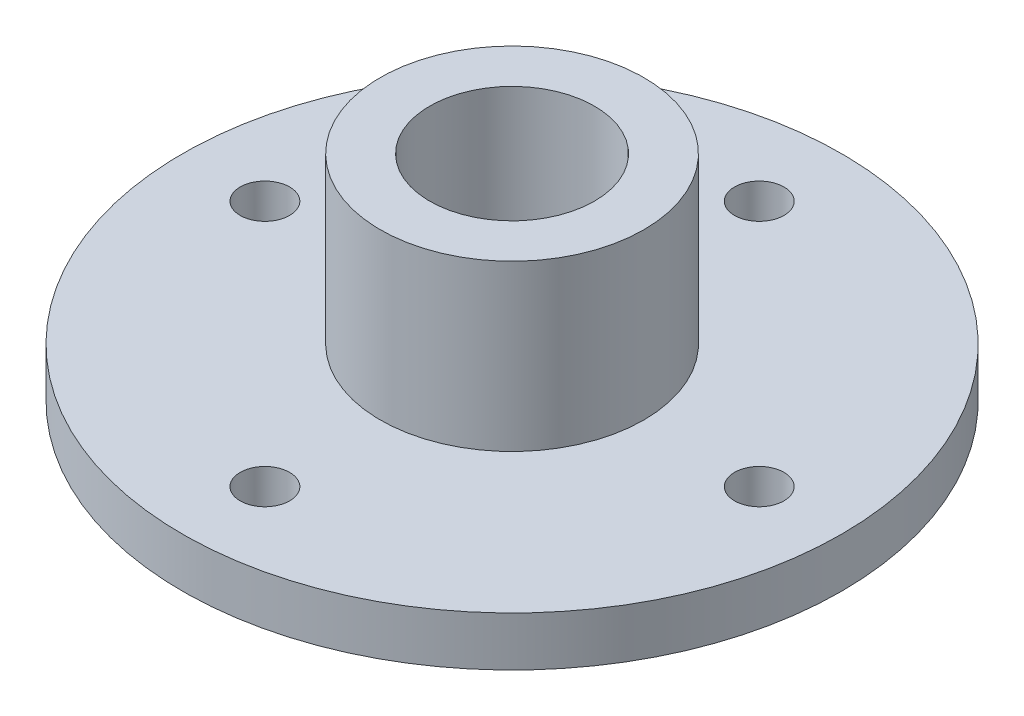
ISO-10303-21;
HEADER;
FILE_DESCRIPTION(('STEP AP214'),'2;1');
FILE_NAME('part.step','',(''),(''),'','','');
FILE_SCHEMA(('AUTOMOTIVE_DESIGN { 1 0 10303 214 1 1 1 1 }'));
ENDSEC;
DATA;
#1=APPLICATION_CONTEXT('core data for automotive mechanical design processes');
#2=APPLICATION_PROTOCOL_DEFINITION('international standard','automotive_design',2000,#1);
#3=PRODUCT_CONTEXT('',#1,'mechanical');
#4=PRODUCT('Part','Part','',(#3));
#5=PRODUCT_RELATED_PRODUCT_CATEGORY('part','',(#4));
#6=PRODUCT_DEFINITION_FORMATION('','',#4);
#7=PRODUCT_DEFINITION_CONTEXT('part definition',#1,'design');
#8=PRODUCT_DEFINITION('design','',#6,#7);
#9=PRODUCT_DEFINITION_SHAPE('','',#8);
#10=(LENGTH_UNIT() NAMED_UNIT(*) SI_UNIT(.MILLI.,.METRE.));
#11=(NAMED_UNIT(*) PLANE_ANGLE_UNIT() SI_UNIT($,.RADIAN.));
#12=(NAMED_UNIT(*) SI_UNIT($,.STERADIAN.) SOLID_ANGLE_UNIT());
#13=UNCERTAINTY_MEASURE_WITH_UNIT(LENGTH_MEASURE(1.E-05),#10,'distance_accuracy_value','');
#14=(GEOMETRIC_REPRESENTATION_CONTEXT(3) GLOBAL_UNCERTAINTY_ASSIGNED_CONTEXT((#13)) GLOBAL_UNIT_ASSIGNED_CONTEXT((#10,
#11,#12)) REPRESENTATION_CONTEXT('',''));
#15=CARTESIAN_POINT('',(0.,0.,0.));
#16=DIRECTION('',(0.,0.,1.));
#17=DIRECTION('',(1.,0.,0.));
#18=AXIS2_PLACEMENT_3D('',#15,#16,#17);
#19=CARTESIAN_POINT('',(1.96764178370323E-12,-573.614855464536,0.));
#20=DIRECTION('',(0.,-1.,0.));
#21=DIRECTION('',(1.,0.,0.));
#22=AXIS2_PLACEMENT_3D('',#19,#20,#21);
#23=CYLINDRICAL_SURFACE('',#22,5.00000000002364);
#24=CARTESIAN_POINT('',(0.,13.,0.));
#25=DIRECTION('',(0.,-1.,0.));
#26=DIRECTION('',(1.,0.,0.));
#27=AXIS2_PLACEMENT_3D('',#24,#25,#26);
#28=CIRCLE('',#27,5.00000000000003);
#29=CARTESIAN_POINT('',(4.99999999999999,13.,0.));
#30=VERTEX_POINT('',#29);
#31=EDGE_CURVE('E65',#30,#30,#28,.T.);
#32=ORIENTED_EDGE('',*,*,#31,.F.);
#33=EDGE_LOOP('',(#32));
#34=FACE_BOUND('',#33,.T.);
#35=CARTESIAN_POINT('',(0.,0.,0.));
#36=DIRECTION('',(0.,-1.,0.));
#37=DIRECTION('',(1.,0.,0.));
#38=AXIS2_PLACEMENT_3D('',#35,#36,#37);
#39=CIRCLE('',#38,5.00000000004725);
#40=CARTESIAN_POINT('',(5.00000000004725,0.,0.));
#41=VERTEX_POINT('',#40);
#42=EDGE_CURVE('E10',#41,#41,#39,.T.);
#43=ORIENTED_EDGE('',*,*,#42,.T.);
#44=EDGE_LOOP('',(#43));
#45=FACE_BOUND('',#44,.T.);
#46=ADVANCED_FACE('F38',(#34,#45),#23,.F.);
#47=CARTESIAN_POINT('',(-5.00000000004725,0.,0.));
#48=DIRECTION('',(0.,1.,0.));
#49=DIRECTION('',(-1.,0.,0.));
#50=AXIS2_PLACEMENT_3D('',#47,#48,#49);
#51=PLANE('',#50);
#52=CARTESIAN_POINT('',(0.,0.,-15.));
#53=DIRECTION('',(0.,1.,0.));
#54=DIRECTION('',(-1.,0.,0.));
#55=AXIS2_PLACEMENT_3D('',#52,#53,#54);
#56=CIRCLE('',#55,1.5);
#57=CARTESIAN_POINT('',(-1.5,0.,-15.));
#58=VERTEX_POINT('',#57);
#59=EDGE_CURVE('E58',#58,#58,#56,.T.);
#60=ORIENTED_EDGE('',*,*,#59,.T.);
#61=EDGE_LOOP('',(#60));
#62=FACE_BOUND('',#61,.T.);
#63=CARTESIAN_POINT('',(15.,0.,0.));
#64=DIRECTION('',(0.,1.,0.));
#65=DIRECTION('',(-1.,0.,0.));
#66=AXIS2_PLACEMENT_3D('',#63,#64,#65);
#67=CIRCLE('',#66,1.5);
#68=CARTESIAN_POINT('',(13.5,0.,0.));
#69=VERTEX_POINT('',#68);
#70=EDGE_CURVE('E126',#69,#69,#67,.T.);
#71=ORIENTED_EDGE('',*,*,#70,.T.);
#72=EDGE_LOOP('',(#71));
#73=FACE_BOUND('',#72,.T.);
#74=CARTESIAN_POINT('',(-1.04744440165294E-13,0.,15.));
#75=DIRECTION('',(0.,1.,0.));
#76=DIRECTION('',(-1.,0.,0.));
#77=AXIS2_PLACEMENT_3D('',#74,#75,#76);
#78=CIRCLE('',#77,1.5);
#79=CARTESIAN_POINT('',(-1.5000000000001,0.,15.));
#80=VERTEX_POINT('',#79);
#81=EDGE_CURVE('E130',#80,#80,#78,.T.);
#82=ORIENTED_EDGE('',*,*,#81,.T.);
#83=EDGE_LOOP('',(#82));
#84=FACE_BOUND('',#83,.T.);
#85=CARTESIAN_POINT('',(-15.,-1.02782365951626E-13,-1.57116660247941E-13));
#86=DIRECTION('',(0.,1.,0.));
#87=DIRECTION('',(-1.,0.,0.));
#88=AXIS2_PLACEMENT_3D('',#85,#86,#87);
#89=CIRCLE('',#88,1.5);
#90=CARTESIAN_POINT('',(-16.5,-1.07927739449954E-13,-1.57116660247941E-13));
#91=VERTEX_POINT('',#90);
#92=EDGE_CURVE('E77',#91,#91,#89,.T.);
#93=ORIENTED_EDGE('',*,*,#92,.T.);
#94=EDGE_LOOP('',(#93));
#95=FACE_BOUND('',#94,.T.);
#96=ORIENTED_EDGE('',*,*,#42,.F.);
#97=EDGE_LOOP('',(#96));
#98=FACE_BOUND('',#97,.T.);
#99=CARTESIAN_POINT('',(0.,1.11022302462516E-13,0.));
#100=DIRECTION('',(0.,-1.,0.));
#101=DIRECTION('',(1.,0.,0.));
#102=AXIS2_PLACEMENT_3D('',#99,#100,#101);
#103=CIRCLE('',#102,20.0000000000001);
#104=CARTESIAN_POINT('',(20.0000000000001,1.79627282440231E-13,0.));
#105=VERTEX_POINT('',#104);
#106=EDGE_CURVE('E45',#105,#105,#103,.T.);
#107=ORIENTED_EDGE('',*,*,#106,.T.);
#108=EDGE_LOOP('',(#107));
#109=FACE_BOUND('',#108,.T.);
#110=ADVANCED_FACE('F109',(#62,#73,#84,#95,#98,#109),#51,.F.);
#111=CARTESIAN_POINT('',(1.96764178370323E-12,-573.614855464536,0.));
#112=DIRECTION('',(0.,-1.,0.));
#113=DIRECTION('',(1.,0.,0.));
#114=AXIS2_PLACEMENT_3D('',#111,#112,#113);
#115=CYLINDRICAL_SURFACE('',#114,20.0000000000001);
#116=ORIENTED_EDGE('',*,*,#106,.F.);
#117=EDGE_LOOP('',(#116));
#118=FACE_BOUND('',#117,.T.);
#119=CARTESIAN_POINT('',(0.,3.00000000000011,0.));
#120=DIRECTION('',(0.,-1.,0.));
#121=DIRECTION('',(1.,0.,0.));
#122=AXIS2_PLACEMENT_3D('',#119,#120,#121);
#123=CIRCLE('',#122,20.0000000000001);
#124=CARTESIAN_POINT('',(20.,3.00000000000018,0.));
#125=VERTEX_POINT('',#124);
#126=EDGE_CURVE('E50',#125,#125,#123,.T.);
#127=ORIENTED_EDGE('',*,*,#126,.T.);
#128=EDGE_LOOP('',(#127));
#129=FACE_BOUND('',#128,.T.);
#130=ADVANCED_FACE('F84',(#118,#129),#115,.T.);
#131=CARTESIAN_POINT('',(-20.0000000000001,2.99999999999998,0.));
#132=DIRECTION('',(0.,-1.,0.));
#133=DIRECTION('',(1.,0.,0.));
#134=AXIS2_PLACEMENT_3D('',#131,#132,#133);
#135=PLANE('',#134);
#136=CARTESIAN_POINT('',(0.,3.00000000000005,-15.));
#137=DIRECTION('',(0.,-1.,0.));
#138=DIRECTION('',(1.,0.,0.));
#139=AXIS2_PLACEMENT_3D('',#136,#137,#138);
#140=CIRCLE('',#139,1.5);
#141=CARTESIAN_POINT('',(1.49999999999999,3.00000000000005,-15.));
#142=VERTEX_POINT('',#141);
#143=EDGE_CURVE('E41',#142,#142,#140,.T.);
#144=ORIENTED_EDGE('',*,*,#143,.T.);
#145=EDGE_LOOP('',(#144));
#146=FACE_BOUND('',#145,.T.);
#147=CARTESIAN_POINT('',(15.,3.0000000000001,0.));
#148=DIRECTION('',(0.,-1.,0.));
#149=DIRECTION('',(1.,0.,0.));
#150=AXIS2_PLACEMENT_3D('',#147,#148,#149);
#151=CIRCLE('',#150,1.5);
#152=CARTESIAN_POINT('',(16.5,3.0000000000001,0.));
#153=VERTEX_POINT('',#152);
#154=EDGE_CURVE('E60',#153,#153,#151,.T.);
#155=ORIENTED_EDGE('',*,*,#154,.T.);
#156=EDGE_LOOP('',(#155));
#157=FACE_BOUND('',#156,.T.);
#158=CARTESIAN_POINT('',(-1.15035187161952E-13,3.00000000000005,15.));
#159=DIRECTION('',(0.,-1.,0.));
#160=DIRECTION('',(1.,0.,0.));
#161=AXIS2_PLACEMENT_3D('',#158,#159,#160);
#162=CIRCLE('',#161,1.5);
#163=CARTESIAN_POINT('',(1.49999999999988,3.00000000000005,15.));
#164=VERTEX_POINT('',#163);
#165=EDGE_CURVE('E57',#164,#164,#162,.T.);
#166=ORIENTED_EDGE('',*,*,#165,.T.);
#167=EDGE_LOOP('',(#166));
#168=FACE_BOUND('',#167,.T.);
#169=CARTESIAN_POINT('',(-15.,3.,-1.57116660247941E-13));
#170=DIRECTION('',(0.,-1.,0.));
#171=DIRECTION('',(1.,0.,0.));
#172=AXIS2_PLACEMENT_3D('',#169,#170,#171);
#173=CIRCLE('',#172,1.5);
#174=CARTESIAN_POINT('',(-13.5,3.,-1.57116660247941E-13));
#175=VERTEX_POINT('',#174);
#176=EDGE_CURVE('E54',#175,#175,#173,.T.);
#177=ORIENTED_EDGE('',*,*,#176,.T.);
#178=EDGE_LOOP('',(#177));
#179=FACE_BOUND('',#178,.T.);
#180=ORIENTED_EDGE('',*,*,#126,.F.);
#181=EDGE_LOOP('',(#180));
#182=FACE_BOUND('',#181,.T.);
#183=CARTESIAN_POINT('',(0.,3.,0.));
#184=DIRECTION('',(0.,-1.,0.));
#185=DIRECTION('',(1.,0.,0.));
#186=AXIS2_PLACEMENT_3D('',#183,#184,#185);
#187=CIRCLE('',#186,7.99999999999999);
#188=CARTESIAN_POINT('',(7.99999999999998,3.00000000000003,0.));
#189=VERTEX_POINT('',#188);
#190=EDGE_CURVE('E74',#189,#189,#187,.T.);
#191=ORIENTED_EDGE('',*,*,#190,.T.);
#192=EDGE_LOOP('',(#191));
#193=FACE_BOUND('',#192,.T.);
#194=ADVANCED_FACE('F86',(#146,#157,#168,#179,#182,#193),#135,.F.);
#195=CARTESIAN_POINT('',(1.96764178370323E-12,-573.614855464536,0.));
#196=DIRECTION('',(0.,-1.,0.));
#197=DIRECTION('',(1.,0.,0.));
#198=AXIS2_PLACEMENT_3D('',#195,#196,#197);
#199=CYLINDRICAL_SURFACE('',#198,8.00000000000001);
#200=ORIENTED_EDGE('',*,*,#190,.F.);
#201=EDGE_LOOP('',(#200));
#202=FACE_BOUND('',#201,.T.);
#203=CARTESIAN_POINT('',(0.,13.,0.));
#204=DIRECTION('',(0.,-1.,0.));
#205=DIRECTION('',(1.,0.,0.));
#206=AXIS2_PLACEMENT_3D('',#203,#204,#205);
#207=CIRCLE('',#206,8.00000000000003);
#208=CARTESIAN_POINT('',(7.99999999999999,13.,0.));
#209=VERTEX_POINT('',#208);
#210=EDGE_CURVE('E69',#209,#209,#207,.T.);
#211=ORIENTED_EDGE('',*,*,#210,.T.);
#212=EDGE_LOOP('',(#211));
#213=FACE_BOUND('',#212,.T.);
#214=ADVANCED_FACE('F89',(#202,#213),#199,.T.);
#215=CARTESIAN_POINT('',(-8.00000000000008,13.,0.));
#216=DIRECTION('',(0.,-1.,0.));
#217=DIRECTION('',(1.,0.,0.));
#218=AXIS2_PLACEMENT_3D('',#215,#216,#217);
#219=PLANE('',#218);
#220=ORIENTED_EDGE('',*,*,#210,.F.);
#221=EDGE_LOOP('',(#220));
#222=FACE_BOUND('',#221,.T.);
#223=ORIENTED_EDGE('',*,*,#31,.T.);
#224=EDGE_LOOP('',(#223));
#225=FACE_BOUND('',#224,.T.);
#226=ADVANCED_FACE('F95',(#222,#225),#219,.F.);
#227=CARTESIAN_POINT('',(-15.,-1.02782365951626E-13,-1.57116660247941E-13));
#228=DIRECTION('',(0.,1.,0.));
#229=DIRECTION('',(-1.,0.,0.));
#230=AXIS2_PLACEMENT_3D('',#227,#228,#229);
#231=CYLINDRICAL_SURFACE('',#230,1.5);
#232=ORIENTED_EDGE('',*,*,#92,.F.);
#233=EDGE_LOOP('',(#232));
#234=FACE_BOUND('',#233,.T.);
#235=ORIENTED_EDGE('',*,*,#176,.F.);
#236=EDGE_LOOP('',(#235));
#237=FACE_BOUND('',#236,.T.);
#238=ADVANCED_FACE('F100',(#234,#237),#231,.F.);
#239=CARTESIAN_POINT('',(-1.04744440165294E-13,0.,15.));
#240=DIRECTION('',(0.,1.,0.));
#241=DIRECTION('',(-1.,0.,0.));
#242=AXIS2_PLACEMENT_3D('',#239,#240,#241);
#243=CYLINDRICAL_SURFACE('',#242,1.5);
#244=ORIENTED_EDGE('',*,*,#81,.F.);
#245=EDGE_LOOP('',(#244));
#246=FACE_BOUND('',#245,.T.);
#247=ORIENTED_EDGE('',*,*,#165,.F.);
#248=EDGE_LOOP('',(#247));
#249=FACE_BOUND('',#248,.T.);
#250=ADVANCED_FACE('F105',(#246,#249),#243,.F.);
#251=CARTESIAN_POINT('',(15.,0.,0.));
#252=DIRECTION('',(0.,1.,0.));
#253=DIRECTION('',(-1.,0.,0.));
#254=AXIS2_PLACEMENT_3D('',#251,#252,#253);
#255=CYLINDRICAL_SURFACE('',#254,1.5);
#256=ORIENTED_EDGE('',*,*,#70,.F.);
#257=EDGE_LOOP('',(#256));
#258=FACE_BOUND('',#257,.T.);
#259=ORIENTED_EDGE('',*,*,#154,.F.);
#260=EDGE_LOOP('',(#259));
#261=FACE_BOUND('',#260,.T.);
#262=ADVANCED_FACE('F144',(#258,#261),#255,.F.);
#263=CARTESIAN_POINT('',(0.,0.,-15.));
#264=DIRECTION('',(0.,1.,0.));
#265=DIRECTION('',(-1.,0.,0.));
#266=AXIS2_PLACEMENT_3D('',#263,#264,#265);
#267=CYLINDRICAL_SURFACE('',#266,1.5);
#268=ORIENTED_EDGE('',*,*,#59,.F.);
#269=EDGE_LOOP('',(#268));
#270=FACE_BOUND('',#269,.T.);
#271=ORIENTED_EDGE('',*,*,#143,.F.);
#272=EDGE_LOOP('',(#271));
#273=FACE_BOUND('',#272,.T.);
#274=ADVANCED_FACE('F151',(#270,#273),#267,.F.);
#275=CLOSED_SHELL('',(#46,#110,#130,#194,#214,#226,#238,#250,#262,#274));
#276=MANIFOLD_SOLID_BREP('B2',#275);
#277=ADVANCED_BREP_SHAPE_REPRESENTATION('',(#18,#276),#14);
#278=SHAPE_DEFINITION_REPRESENTATION(#9,#277);
ENDSEC;
END-ISO-10303-21;
